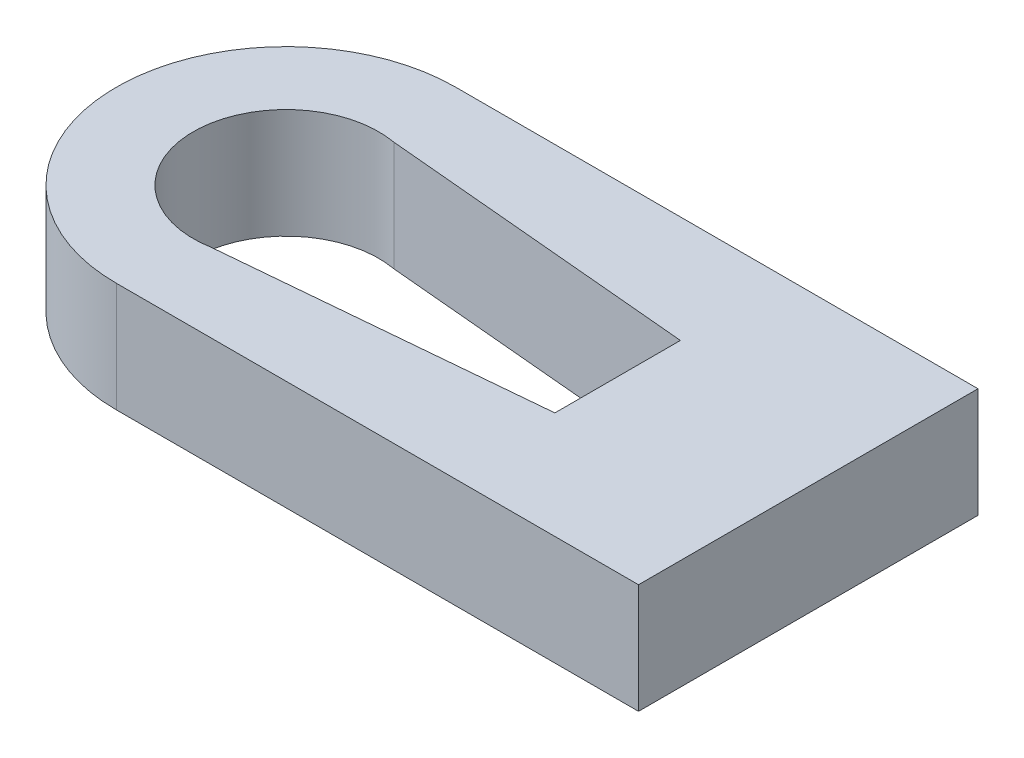
ISO-10303-21;
HEADER;
FILE_DESCRIPTION(('STEP AP214'),'2;1');
FILE_NAME('part.step','',(''),(''),'','','');
FILE_SCHEMA(('AUTOMOTIVE_DESIGN { 1 0 10303 214 1 1 1 1 }'));
ENDSEC;
DATA;
#1=APPLICATION_CONTEXT('core data for automotive mechanical design processes');
#2=APPLICATION_PROTOCOL_DEFINITION('international standard','automotive_design',2000,#1);
#3=PRODUCT_CONTEXT('',#1,'mechanical');
#4=PRODUCT('Part','Part','',(#3));
#5=PRODUCT_RELATED_PRODUCT_CATEGORY('part','',(#4));
#6=PRODUCT_DEFINITION_FORMATION('','',#4);
#7=PRODUCT_DEFINITION_CONTEXT('part definition',#1,'design');
#8=PRODUCT_DEFINITION('design','',#6,#7);
#9=PRODUCT_DEFINITION_SHAPE('','',#8);
#10=(LENGTH_UNIT() NAMED_UNIT(*) SI_UNIT(.MILLI.,.METRE.));
#11=(NAMED_UNIT(*) PLANE_ANGLE_UNIT() SI_UNIT($,.RADIAN.));
#12=(NAMED_UNIT(*) SI_UNIT($,.STERADIAN.) SOLID_ANGLE_UNIT());
#13=UNCERTAINTY_MEASURE_WITH_UNIT(LENGTH_MEASURE(1.E-05),#10,'distance_accuracy_value','');
#14=(GEOMETRIC_REPRESENTATION_CONTEXT(3) GLOBAL_UNCERTAINTY_ASSIGNED_CONTEXT((#13)) GLOBAL_UNIT_ASSIGNED_CONTEXT((#10,
#11,#12)) REPRESENTATION_CONTEXT('',''));
#15=CARTESIAN_POINT('',(0.,0.,0.));
#16=DIRECTION('',(0.,0.,1.));
#17=DIRECTION('',(1.,0.,0.));
#18=AXIS2_PLACEMENT_3D('',#15,#16,#17);
#19=CARTESIAN_POINT('',(0.,23.5,0.));
#20=DIRECTION('',(0.,-1.,0.));
#21=DIRECTION('',(0.,0.,-1.));
#22=AXIS2_PLACEMENT_3D('',#19,#20,#21);
#23=CYLINDRICAL_SURFACE('',#22,6.5);
#24=DIRECTION('',(0.,-1.,0.));
#25=VECTOR('',#24,1.);
#26=CARTESIAN_POINT('',(0.,23.5,6.5));
#27=LINE('',#26,#25);
#28=CARTESIAN_POINT('',(0.,23.5,6.5));
#29=VERTEX_POINT('',#28);
#30=CARTESIAN_POINT('',(0.,19.3,6.5));
#31=VERTEX_POINT('',#30);
#32=EDGE_CURVE('E179',#29,#31,#27,.T.);
#33=ORIENTED_EDGE('',*,*,#32,.F.);
#34=CARTESIAN_POINT('',(0.,23.5,0.));
#35=DIRECTION('',(0.,1.,0.));
#36=DIRECTION('',(0.,0.,1.));
#37=AXIS2_PLACEMENT_3D('',#34,#35,#36);
#38=CIRCLE('',#37,6.5);
#39=CARTESIAN_POINT('',(0.,23.5,-6.5));
#40=VERTEX_POINT('',#39);
#41=EDGE_CURVE('E62',#40,#29,#38,.T.);
#42=ORIENTED_EDGE('',*,*,#41,.F.);
#43=DIRECTION('',(0.,-1.,0.));
#44=VECTOR('',#43,1.);
#45=CARTESIAN_POINT('',(0.,23.5,-6.5));
#46=LINE('',#45,#44);
#47=CARTESIAN_POINT('',(0.,19.3,-6.5));
#48=VERTEX_POINT('',#47);
#49=EDGE_CURVE('E160',#40,#48,#46,.T.);
#50=ORIENTED_EDGE('',*,*,#49,.T.);
#51=CARTESIAN_POINT('',(0.,19.3,0.));
#52=DIRECTION('',(0.,1.,0.));
#53=DIRECTION('',(0.,0.,1.));
#54=AXIS2_PLACEMENT_3D('',#51,#52,#53);
#55=CIRCLE('',#54,6.5);
#56=EDGE_CURVE('E183',#48,#31,#55,.T.);
#57=ORIENTED_EDGE('',*,*,#56,.T.);
#58=EDGE_LOOP('',(#33,#42,#50,#57));
#59=FACE_BOUND('',#58,.T.);
#60=ADVANCED_FACE('F39',(#59),#23,.T.);
#61=CARTESIAN_POINT('',(0.,23.5,0.));
#62=DIRECTION('',(0.,1.,0.));
#63=DIRECTION('',(0.,0.,1.));
#64=AXIS2_PLACEMENT_3D('',#61,#62,#63);
#65=PLANE('',#64);
#66=DIRECTION('',(-0.995948362239352,0.,-0.0899269689956985));
#67=VECTOR('',#66,1.);
#68=CARTESIAN_POINT('',(12.7,23.5,-2.40328140539589));
#69=LINE('',#68,#67);
#70=CARTESIAN_POINT('',(12.7,23.5,-2.40328140539589));
#71=VERTEX_POINT('',#70);
#72=CARTESIAN_POINT('',(0.635894584196152,23.5,-3.49258329575545));
#73=VERTEX_POINT('',#72);
#74=EDGE_CURVE('E128',#71,#73,#69,.T.);
#75=ORIENTED_EDGE('',*,*,#74,.F.);
#76=DIRECTION('',(0.,0.,-1.));
#77=VECTOR('',#76,1.);
#78=CARTESIAN_POINT('',(12.7,23.5,2.40328140539589));
#79=LINE('',#78,#77);
#80=CARTESIAN_POINT('',(12.7,23.5,2.40328140539589));
#81=VERTEX_POINT('',#80);
#82=EDGE_CURVE('E132',#81,#71,#79,.T.);
#83=ORIENTED_EDGE('',*,*,#82,.F.);
#84=DIRECTION('',(0.995948362239352,0.,-0.0899269689956985));
#85=VECTOR('',#84,1.);
#86=CARTESIAN_POINT('',(0.,23.5,3.55));
#87=LINE('',#86,#85);
#88=CARTESIAN_POINT('',(0.635894584196152,23.5,3.49258329575545));
#89=VERTEX_POINT('',#88);
#90=EDGE_CURVE('E107',#89,#81,#87,.T.);
#91=ORIENTED_EDGE('',*,*,#90,.F.);
#92=CARTESIAN_POINT('',(0.,23.5,0.));
#93=DIRECTION('',(0.,1.,0.));
#94=DIRECTION('',(0.,0.,1.));
#95=AXIS2_PLACEMENT_3D('',#92,#93,#94);
#96=CIRCLE('',#95,3.55);
#97=EDGE_CURVE('E142',#73,#89,#96,.T.);
#98=ORIENTED_EDGE('',*,*,#97,.F.);
#99=EDGE_LOOP('',(#75,#83,#91,#98));
#100=FACE_BOUND('',#99,.T.);
#101=ORIENTED_EDGE('',*,*,#41,.T.);
#102=DIRECTION('',(1.,0.,0.));
#103=VECTOR('',#102,1.);
#104=CARTESIAN_POINT('',(0.,23.5,6.5));
#105=LINE('',#104,#103);
#106=CARTESIAN_POINT('',(20.,23.5,6.5));
#107=VERTEX_POINT('',#106);
#108=EDGE_CURVE('E150',#29,#107,#105,.T.);
#109=ORIENTED_EDGE('',*,*,#108,.T.);
#110=DIRECTION('',(0.,0.,-1.));
#111=VECTOR('',#110,1.);
#112=CARTESIAN_POINT('',(20.,23.5,6.5));
#113=LINE('',#112,#111);
#114=CARTESIAN_POINT('',(20.,23.5,-6.5));
#115=VERTEX_POINT('',#114);
#116=EDGE_CURVE('E153',#107,#115,#113,.T.);
#117=ORIENTED_EDGE('',*,*,#116,.T.);
#118=DIRECTION('',(-1.,0.,0.));
#119=VECTOR('',#118,1.);
#120=CARTESIAN_POINT('',(0.,23.5,-6.5));
#121=LINE('',#120,#119);
#122=EDGE_CURVE('E157',#115,#40,#121,.T.);
#123=ORIENTED_EDGE('',*,*,#122,.T.);
#124=EDGE_LOOP('',(#101,#109,#117,#123));
#125=FACE_BOUND('',#124,.T.);
#126=ADVANCED_FACE('F193',(#100,#125),#65,.T.);
#127=CARTESIAN_POINT('',(0.,19.3,0.));
#128=DIRECTION('',(0.,1.,0.));
#129=DIRECTION('',(0.,0.,1.));
#130=AXIS2_PLACEMENT_3D('',#127,#128,#129);
#131=PLANE('',#130);
#132=DIRECTION('',(0.,0.,-1.));
#133=VECTOR('',#132,1.);
#134=CARTESIAN_POINT('',(12.7,19.3,2.40328140539589));
#135=LINE('',#134,#133);
#136=CARTESIAN_POINT('',(12.7,19.3,2.40328140539589));
#137=VERTEX_POINT('',#136);
#138=CARTESIAN_POINT('',(12.7,19.3,-2.40328140539589));
#139=VERTEX_POINT('',#138);
#140=EDGE_CURVE('E116',#137,#139,#135,.T.);
#141=ORIENTED_EDGE('',*,*,#140,.T.);
#142=DIRECTION('',(-0.995948362239352,0.,-0.0899269689956985));
#143=VECTOR('',#142,1.);
#144=CARTESIAN_POINT('',(12.7,19.3,-2.40328140539589));
#145=LINE('',#144,#143);
#146=CARTESIAN_POINT('',(0.635894584196152,19.3,-3.49258329575545));
#147=VERTEX_POINT('',#146);
#148=EDGE_CURVE('E113',#139,#147,#145,.T.);
#149=ORIENTED_EDGE('',*,*,#148,.T.);
#150=CARTESIAN_POINT('',(0.,19.3,0.));
#151=DIRECTION('',(0.,1.,0.));
#152=DIRECTION('',(0.,0.,1.));
#153=AXIS2_PLACEMENT_3D('',#150,#151,#152);
#154=CIRCLE('',#153,3.55);
#155=CARTESIAN_POINT('',(0.635894584196152,19.3,3.49258329575545));
#156=VERTEX_POINT('',#155);
#157=EDGE_CURVE('E126',#147,#156,#154,.T.);
#158=ORIENTED_EDGE('',*,*,#157,.T.);
#159=DIRECTION('',(0.995948362239352,0.,-0.0899269689956985));
#160=VECTOR('',#159,1.);
#161=CARTESIAN_POINT('',(0.,19.3,3.55));
#162=LINE('',#161,#160);
#163=EDGE_CURVE('E54',#156,#137,#162,.T.);
#164=ORIENTED_EDGE('',*,*,#163,.T.);
#165=EDGE_LOOP('',(#141,#149,#158,#164));
#166=FACE_BOUND('',#165,.T.);
#167=ORIENTED_EDGE('',*,*,#56,.F.);
#168=DIRECTION('',(-1.,0.,0.));
#169=VECTOR('',#168,1.);
#170=CARTESIAN_POINT('',(0.,19.3,-6.5));
#171=LINE('',#170,#169);
#172=CARTESIAN_POINT('',(20.,19.3,-6.5));
#173=VERTEX_POINT('',#172);
#174=EDGE_CURVE('E154',#173,#48,#171,.T.);
#175=ORIENTED_EDGE('',*,*,#174,.F.);
#176=DIRECTION('',(0.,0.,-1.));
#177=VECTOR('',#176,1.);
#178=CARTESIAN_POINT('',(20.,19.3,6.5));
#179=LINE('',#178,#177);
#180=CARTESIAN_POINT('',(20.,19.3,6.5));
#181=VERTEX_POINT('',#180);
#182=EDGE_CURVE('E163',#181,#173,#179,.T.);
#183=ORIENTED_EDGE('',*,*,#182,.F.);
#184=DIRECTION('',(1.,0.,0.));
#185=VECTOR('',#184,1.);
#186=CARTESIAN_POINT('',(0.,19.3,6.5));
#187=LINE('',#186,#185);
#188=EDGE_CURVE('E146',#31,#181,#187,.T.);
#189=ORIENTED_EDGE('',*,*,#188,.F.);
#190=EDGE_LOOP('',(#167,#175,#183,#189));
#191=FACE_BOUND('',#190,.T.);
#192=ADVANCED_FACE('F124',(#166,#191),#131,.F.);
#193=CARTESIAN_POINT('',(0.,23.5,6.5));
#194=DIRECTION('',(0.,0.,-1.));
#195=DIRECTION('',(-1.,0.,0.));
#196=AXIS2_PLACEMENT_3D('',#193,#194,#195);
#197=PLANE('',#196);
#198=ORIENTED_EDGE('',*,*,#188,.T.);
#199=DIRECTION('',(0.,-1.,0.));
#200=VECTOR('',#199,1.);
#201=CARTESIAN_POINT('',(20.,23.5,6.5));
#202=LINE('',#201,#200);
#203=EDGE_CURVE('E175',#107,#181,#202,.T.);
#204=ORIENTED_EDGE('',*,*,#203,.F.);
#205=ORIENTED_EDGE('',*,*,#108,.F.);
#206=ORIENTED_EDGE('',*,*,#32,.T.);
#207=EDGE_LOOP('',(#198,#204,#205,#206));
#208=FACE_BOUND('',#207,.T.);
#209=ADVANCED_FACE('F218',(#208),#197,.F.);
#210=CARTESIAN_POINT('',(20.,23.5,6.5));
#211=DIRECTION('',(-1.,0.,0.));
#212=DIRECTION('',(0.,0.,1.));
#213=AXIS2_PLACEMENT_3D('',#210,#211,#212);
#214=PLANE('',#213);
#215=ORIENTED_EDGE('',*,*,#182,.T.);
#216=DIRECTION('',(0.,-1.,0.));
#217=VECTOR('',#216,1.);
#218=CARTESIAN_POINT('',(20.,23.5,-6.5));
#219=LINE('',#218,#217);
#220=EDGE_CURVE('E171',#115,#173,#219,.T.);
#221=ORIENTED_EDGE('',*,*,#220,.F.);
#222=ORIENTED_EDGE('',*,*,#116,.F.);
#223=ORIENTED_EDGE('',*,*,#203,.T.);
#224=EDGE_LOOP('',(#215,#221,#222,#223));
#225=FACE_BOUND('',#224,.T.);
#226=ADVANCED_FACE('F223',(#225),#214,.F.);
#227=CARTESIAN_POINT('',(0.,23.5,-6.5));
#228=DIRECTION('',(0.,0.,1.));
#229=DIRECTION('',(1.,0.,0.));
#230=AXIS2_PLACEMENT_3D('',#227,#228,#229);
#231=PLANE('',#230);
#232=ORIENTED_EDGE('',*,*,#174,.T.);
#233=ORIENTED_EDGE('',*,*,#49,.F.);
#234=ORIENTED_EDGE('',*,*,#122,.F.);
#235=ORIENTED_EDGE('',*,*,#220,.T.);
#236=EDGE_LOOP('',(#232,#233,#234,#235));
#237=FACE_BOUND('',#236,.T.);
#238=ADVANCED_FACE('F204',(#237),#231,.F.);
#239=CARTESIAN_POINT('',(0.,19.3,0.));
#240=DIRECTION('',(0.,1.,0.));
#241=DIRECTION('',(0.,0.,1.));
#242=AXIS2_PLACEMENT_3D('',#239,#240,#241);
#243=CYLINDRICAL_SURFACE('',#242,3.55);
#244=ORIENTED_EDGE('',*,*,#97,.T.);
#245=DIRECTION('',(0.,1.,0.));
#246=VECTOR('',#245,1.);
#247=CARTESIAN_POINT('',(0.63589458419616,19.3,3.49258329575545));
#248=LINE('',#247,#246);
#249=EDGE_CURVE('E47',#89,#156,#248,.F.);
#250=ORIENTED_EDGE('',*,*,#249,.T.);
#251=ORIENTED_EDGE('',*,*,#157,.F.);
#252=DIRECTION('',(0.,1.,0.));
#253=VECTOR('',#252,1.);
#254=CARTESIAN_POINT('',(0.63589458419616,19.3,-3.49258329575545));
#255=LINE('',#254,#253);
#256=EDGE_CURVE('E11',#147,#73,#255,.T.);
#257=ORIENTED_EDGE('',*,*,#256,.T.);
#258=EDGE_LOOP('',(#244,#250,#251,#257));
#259=FACE_BOUND('',#258,.T.);
#260=ADVANCED_FACE('F189',(#259),#243,.F.);
#261=CARTESIAN_POINT('',(12.7,19.3,-2.40328140539589));
#262=DIRECTION('',(0.0899269689956985,0.,-0.995948362239351));
#263=DIRECTION('',(-0.995948362239352,0.,-0.0899269689956985));
#264=AXIS2_PLACEMENT_3D('',#261,#262,#263);
#265=PLANE('',#264);
#266=ORIENTED_EDGE('',*,*,#148,.F.);
#267=DIRECTION('',(0.,1.,0.));
#268=VECTOR('',#267,1.);
#269=CARTESIAN_POINT('',(12.7,19.3,-2.40328140539589));
#270=LINE('',#269,#268);
#271=EDGE_CURVE('E112',#139,#71,#270,.T.);
#272=ORIENTED_EDGE('',*,*,#271,.T.);
#273=ORIENTED_EDGE('',*,*,#74,.T.);
#274=ORIENTED_EDGE('',*,*,#256,.F.);
#275=EDGE_LOOP('',(#266,#272,#273,#274));
#276=FACE_BOUND('',#275,.T.);
#277=ADVANCED_FACE('F196',(#276),#265,.F.);
#278=CARTESIAN_POINT('',(0.,19.3,3.55));
#279=DIRECTION('',(0.0899269689956985,0.,0.995948362239351));
#280=DIRECTION('',(0.995948362239352,0.,-0.0899269689956985));
#281=AXIS2_PLACEMENT_3D('',#278,#279,#280);
#282=PLANE('',#281);
#283=ORIENTED_EDGE('',*,*,#90,.T.);
#284=DIRECTION('',(0.,1.,0.));
#285=VECTOR('',#284,1.);
#286=CARTESIAN_POINT('',(12.7,19.3,2.40328140539589));
#287=LINE('',#286,#285);
#288=EDGE_CURVE('E103',#137,#81,#287,.T.);
#289=ORIENTED_EDGE('',*,*,#288,.F.);
#290=ORIENTED_EDGE('',*,*,#163,.F.);
#291=ORIENTED_EDGE('',*,*,#249,.F.);
#292=EDGE_LOOP('',(#283,#289,#290,#291));
#293=FACE_BOUND('',#292,.T.);
#294=ADVANCED_FACE('F105',(#293),#282,.F.);
#295=CARTESIAN_POINT('',(12.7,19.3,2.40328140539589));
#296=DIRECTION('',(1.,0.,0.));
#297=DIRECTION('',(0.,0.,-1.));
#298=AXIS2_PLACEMENT_3D('',#295,#296,#297);
#299=PLANE('',#298);
#300=ORIENTED_EDGE('',*,*,#82,.T.);
#301=ORIENTED_EDGE('',*,*,#271,.F.);
#302=ORIENTED_EDGE('',*,*,#140,.F.);
#303=ORIENTED_EDGE('',*,*,#288,.T.);
#304=EDGE_LOOP('',(#300,#301,#302,#303));
#305=FACE_BOUND('',#304,.T.);
#306=ADVANCED_FACE('F117',(#305),#299,.F.);
#307=CLOSED_SHELL('',(#60,#126,#192,#209,#226,#238,#260,#277,#294,#306));
#308=MANIFOLD_SOLID_BREP('B2',#307);
#309=ADVANCED_BREP_SHAPE_REPRESENTATION('',(#18,#308),#14);
#310=SHAPE_DEFINITION_REPRESENTATION(#9,#309);
ENDSEC;
END-ISO-10303-21;
